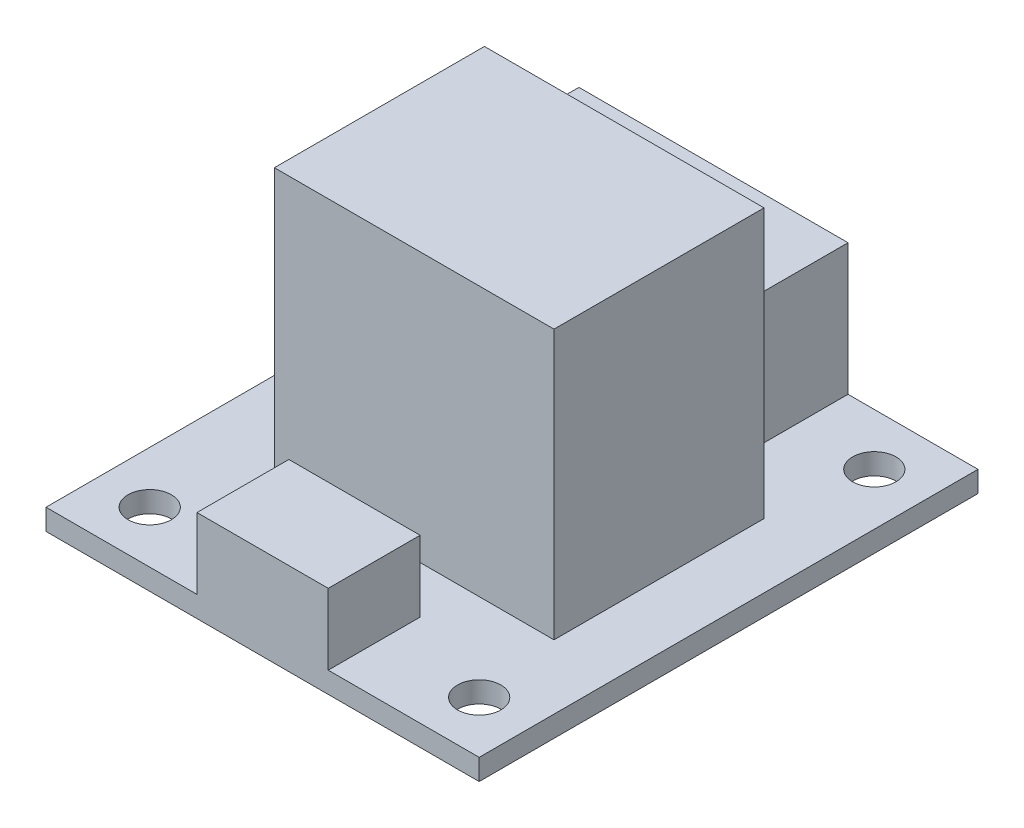
ISO-10303-21;
HEADER;
FILE_DESCRIPTION(('STEP AP214'),'2;1');
FILE_NAME('part.step','',(''),(''),'','','');
FILE_SCHEMA(('AUTOMOTIVE_DESIGN { 1 0 10303 214 1 1 1 1 }'));
ENDSEC;
DATA;
#1=APPLICATION_CONTEXT('core data for automotive mechanical design processes');
#2=APPLICATION_PROTOCOL_DEFINITION('international standard','automotive_design',2000,#1);
#3=PRODUCT_CONTEXT('',#1,'mechanical');
#4=PRODUCT('Part','Part','',(#3));
#5=PRODUCT_RELATED_PRODUCT_CATEGORY('part','',(#4));
#6=PRODUCT_DEFINITION_FORMATION('','',#4);
#7=PRODUCT_DEFINITION_CONTEXT('part definition',#1,'design');
#8=PRODUCT_DEFINITION('design','',#6,#7);
#9=PRODUCT_DEFINITION_SHAPE('','',#8);
#10=(LENGTH_UNIT() NAMED_UNIT(*) SI_UNIT(.MILLI.,.METRE.));
#11=(NAMED_UNIT(*) PLANE_ANGLE_UNIT() SI_UNIT($,.RADIAN.));
#12=(NAMED_UNIT(*) SI_UNIT($,.STERADIAN.) SOLID_ANGLE_UNIT());
#13=UNCERTAINTY_MEASURE_WITH_UNIT(LENGTH_MEASURE(1.E-05),#10,'distance_accuracy_value','');
#14=(GEOMETRIC_REPRESENTATION_CONTEXT(3) GLOBAL_UNCERTAINTY_ASSIGNED_CONTEXT((#13)) GLOBAL_UNIT_ASSIGNED_CONTEXT((#10,
#11,#12)) REPRESENTATION_CONTEXT('',''));
#15=CARTESIAN_POINT('',(0.,0.,0.));
#16=DIRECTION('',(0.,0.,1.));
#17=DIRECTION('',(1.,0.,0.));
#18=AXIS2_PLACEMENT_3D('',#15,#16,#17);
#19=CARTESIAN_POINT('',(0.,1.6,0.));
#20=DIRECTION('',(0.,-1.,0.));
#21=DIRECTION('',(0.,0.,-1.));
#22=AXIS2_PLACEMENT_3D('',#19,#20,#21);
#23=PLANE('',#22);
#24=DIRECTION('',(0.,0.,1.));
#25=VECTOR('',#24,1.);
#26=CARTESIAN_POINT('',(6.8,1.6,-26.6));
#27=LINE('',#26,#25);
#28=CARTESIAN_POINT('',(6.8,1.6,-26.6));
#29=VERTEX_POINT('',#28);
#30=CARTESIAN_POINT('',(6.8,1.6,-10.6));
#31=VERTEX_POINT('',#30);
#32=EDGE_CURVE('E168',#29,#31,#27,.T.);
#33=ORIENTED_EDGE('',*,*,#32,.F.);
#34=DIRECTION('',(-1.,0.,0.));
#35=VECTOR('',#34,1.);
#36=CARTESIAN_POINT('',(6.8,1.6,-26.6));
#37=LINE('',#36,#35);
#38=CARTESIAN_POINT('',(28.1,1.6,-26.6));
#39=VERTEX_POINT('',#38);
#40=EDGE_CURVE('E181',#39,#29,#37,.T.);
#41=ORIENTED_EDGE('',*,*,#40,.F.);
#42=DIRECTION('',(0.,0.,-1.));
#43=VECTOR('',#42,1.);
#44=CARTESIAN_POINT('',(28.1,1.6,-26.6));
#45=LINE('',#44,#43);
#46=CARTESIAN_POINT('',(28.1,1.6,-10.6));
#47=VERTEX_POINT('',#46);
#48=EDGE_CURVE('E190',#47,#39,#45,.T.);
#49=ORIENTED_EDGE('',*,*,#48,.F.);
#50=DIRECTION('',(1.,0.,0.));
#51=VECTOR('',#50,1.);
#52=CARTESIAN_POINT('',(6.8,1.6,-10.6));
#53=LINE('',#52,#51);
#54=EDGE_CURVE('E171',#31,#47,#53,.T.);
#55=ORIENTED_EDGE('',*,*,#54,.F.);
#56=EDGE_LOOP('',(#33,#41,#49,#55));
#57=FACE_BOUND('',#56,.T.);
#58=CARTESIAN_POINT('',(29.05,1.6,-3.95));
#59=DIRECTION('',(0.,1.,0.));
#60=DIRECTION('',(0.,0.,1.));
#61=AXIS2_PLACEMENT_3D('',#58,#59,#60);
#62=CIRCLE('',#61,1.65);
#63=CARTESIAN_POINT('',(29.05,1.6,-2.3));
#64=VERTEX_POINT('',#63);
#65=EDGE_CURVE('E240',#64,#64,#62,.T.);
#66=ORIENTED_EDGE('',*,*,#65,.F.);
#67=EDGE_LOOP('',(#66));
#68=FACE_BOUND('',#67,.T.);
#69=CARTESIAN_POINT('',(3.95,1.6,-3.95));
#70=DIRECTION('',(0.,1.,0.));
#71=DIRECTION('',(0.,0.,-1.));
#72=AXIS2_PLACEMENT_3D('',#69,#70,#71);
#73=CIRCLE('',#72,1.65);
#74=CARTESIAN_POINT('',(3.95,1.6,-5.6));
#75=VERTEX_POINT('',#74);
#76=EDGE_CURVE('E241',#75,#75,#73,.T.);
#77=ORIENTED_EDGE('',*,*,#76,.F.);
#78=EDGE_LOOP('',(#77));
#79=FACE_BOUND('',#78,.T.);
#80=CARTESIAN_POINT('',(29.05,1.6,-34.05));
#81=DIRECTION('',(0.,1.,0.));
#82=DIRECTION('',(0.,0.,-1.));
#83=AXIS2_PLACEMENT_3D('',#80,#81,#82);
#84=CIRCLE('',#83,1.65);
#85=CARTESIAN_POINT('',(29.05,1.6,-35.7));
#86=VERTEX_POINT('',#85);
#87=EDGE_CURVE('E236',#86,#86,#84,.T.);
#88=ORIENTED_EDGE('',*,*,#87,.F.);
#89=EDGE_LOOP('',(#88));
#90=FACE_BOUND('',#89,.T.);
#91=DIRECTION('',(0.,0.,1.));
#92=VECTOR('',#91,1.);
#93=CARTESIAN_POINT('',(2.6,1.6,-38.));
#94=LINE('',#93,#92);
#95=CARTESIAN_POINT('',(2.6,1.6,-38.));
#96=VERTEX_POINT('',#95);
#97=CARTESIAN_POINT('',(2.6,1.6,-29.7));
#98=VERTEX_POINT('',#97);
#99=EDGE_CURVE('E167',#96,#98,#94,.T.);
#100=ORIENTED_EDGE('',*,*,#99,.F.);
#101=DIRECTION('',(-1.,0.,0.));
#102=VECTOR('',#101,1.);
#103=CARTESIAN_POINT('',(0.,1.6,-38.));
#104=LINE('',#103,#102);
#105=CARTESIAN_POINT('',(0.,1.6,-38.));
#106=VERTEX_POINT('',#105);
#107=EDGE_CURVE('E264',#96,#106,#104,.T.);
#108=ORIENTED_EDGE('',*,*,#107,.T.);
#109=DIRECTION('',(0.,0.,1.));
#110=VECTOR('',#109,1.);
#111=CARTESIAN_POINT('',(0.,1.6,0.));
#112=LINE('',#111,#110);
#113=CARTESIAN_POINT('',(0.,1.6,0.));
#114=VERTEX_POINT('',#113);
#115=EDGE_CURVE('E255',#106,#114,#112,.T.);
#116=ORIENTED_EDGE('',*,*,#115,.T.);
#117=DIRECTION('',(1.,0.,0.));
#118=VECTOR('',#117,1.);
#119=CARTESIAN_POINT('',(0.,1.6,0.));
#120=LINE('',#119,#118);
#121=CARTESIAN_POINT('',(11.5,1.6,0.));
#122=VERTEX_POINT('',#121);
#123=EDGE_CURVE('E260',#114,#122,#120,.T.);
#124=ORIENTED_EDGE('',*,*,#123,.T.);
#125=DIRECTION('',(0.,0.,1.));
#126=VECTOR('',#125,1.);
#127=CARTESIAN_POINT('',(11.5,1.6,-7.));
#128=LINE('',#127,#126);
#129=CARTESIAN_POINT('',(11.5,1.6,-7.));
#130=VERTEX_POINT('',#129);
#131=EDGE_CURVE('E206',#130,#122,#128,.T.);
#132=ORIENTED_EDGE('',*,*,#131,.F.);
#133=DIRECTION('',(-1.,0.,0.));
#134=VECTOR('',#133,1.);
#135=CARTESIAN_POINT('',(21.5,1.6,-7.));
#136=LINE('',#135,#134);
#137=CARTESIAN_POINT('',(21.5,1.6,-7.));
#138=VERTEX_POINT('',#137);
#139=EDGE_CURVE('E211',#138,#130,#136,.T.);
#140=ORIENTED_EDGE('',*,*,#139,.F.);
#141=DIRECTION('',(0.,0.,-1.));
#142=VECTOR('',#141,1.);
#143=CARTESIAN_POINT('',(21.5,1.6,-7.));
#144=LINE('',#143,#142);
#145=CARTESIAN_POINT('',(21.5,1.6,0.));
#146=VERTEX_POINT('',#145);
#147=EDGE_CURVE('E220',#146,#138,#144,.T.);
#148=ORIENTED_EDGE('',*,*,#147,.F.);
#149=CARTESIAN_POINT('',(33.,1.6,0.));
#150=VERTEX_POINT('',#149);
#151=EDGE_CURVE('E258',#146,#150,#120,.T.);
#152=ORIENTED_EDGE('',*,*,#151,.T.);
#153=DIRECTION('',(0.,0.,-1.));
#154=VECTOR('',#153,1.);
#155=CARTESIAN_POINT('',(33.,1.6,0.));
#156=LINE('',#155,#154);
#157=CARTESIAN_POINT('',(33.,1.6,-38.));
#158=VERTEX_POINT('',#157);
#159=EDGE_CURVE('E262',#150,#158,#156,.T.);
#160=ORIENTED_EDGE('',*,*,#159,.T.);
#161=CARTESIAN_POINT('',(23.1,1.6,-38.));
#162=VERTEX_POINT('',#161);
#163=EDGE_CURVE('E265',#158,#162,#104,.T.);
#164=ORIENTED_EDGE('',*,*,#163,.T.);
#165=DIRECTION('',(0.,0.,-1.));
#166=VECTOR('',#165,1.);
#167=CARTESIAN_POINT('',(23.1,1.6,-38.));
#168=LINE('',#167,#166);
#169=CARTESIAN_POINT('',(23.1,1.6,-29.7));
#170=VERTEX_POINT('',#169);
#171=EDGE_CURVE('E54',#170,#162,#168,.T.);
#172=ORIENTED_EDGE('',*,*,#171,.F.);
#173=DIRECTION('',(1.,0.,0.));
#174=VECTOR('',#173,1.);
#175=CARTESIAN_POINT('',(2.6,1.6,-29.7));
#176=LINE('',#175,#174);
#177=EDGE_CURVE('E49',#98,#170,#176,.T.);
#178=ORIENTED_EDGE('',*,*,#177,.F.);
#179=EDGE_LOOP('',(#100,#108,#116,#124,#132,#140,#148,#152,#160,#164,#172,#178));
#180=FACE_BOUND('',#179,.T.);
#181=ADVANCED_FACE('F34',(#57,#68,#79,#90,#180),#23,.F.);
#182=CARTESIAN_POINT('',(0.,1.6,0.));
#183=DIRECTION('',(1.,0.,0.));
#184=DIRECTION('',(0.,0.,-1.));
#185=AXIS2_PLACEMENT_3D('',#182,#183,#184);
#186=PLANE('',#185);
#187=DIRECTION('',(0.,0.,1.));
#188=VECTOR('',#187,1.);
#189=CARTESIAN_POINT('',(0.,0.,0.));
#190=LINE('',#189,#188);
#191=CARTESIAN_POINT('',(0.,0.,-38.));
#192=VERTEX_POINT('',#191);
#193=CARTESIAN_POINT('',(0.,0.,0.));
#194=VERTEX_POINT('',#193);
#195=EDGE_CURVE('E252',#192,#194,#190,.T.);
#196=ORIENTED_EDGE('',*,*,#195,.T.);
#197=DIRECTION('',(0.,-1.,0.));
#198=VECTOR('',#197,1.);
#199=CARTESIAN_POINT('',(0.,1.6,0.));
#200=LINE('',#199,#198);
#201=EDGE_CURVE('E11',#114,#194,#200,.T.);
#202=ORIENTED_EDGE('',*,*,#201,.F.);
#203=ORIENTED_EDGE('',*,*,#115,.F.);
#204=DIRECTION('',(0.,-1.,0.));
#205=VECTOR('',#204,1.);
#206=CARTESIAN_POINT('',(0.,1.6,-38.));
#207=LINE('',#206,#205);
#208=EDGE_CURVE('E267',#106,#192,#207,.T.);
#209=ORIENTED_EDGE('',*,*,#208,.T.);
#210=EDGE_LOOP('',(#196,#202,#203,#209));
#211=FACE_BOUND('',#210,.T.);
#212=ADVANCED_FACE('F36',(#211),#186,.F.);
#213=CARTESIAN_POINT('',(0.,1.6,0.));
#214=DIRECTION('',(0.,0.,-1.));
#215=DIRECTION('',(-1.,0.,0.));
#216=AXIS2_PLACEMENT_3D('',#213,#214,#215);
#217=PLANE('',#216);
#218=DIRECTION('',(1.,0.,0.));
#219=VECTOR('',#218,1.);
#220=CARTESIAN_POINT('',(0.,0.,0.));
#221=LINE('',#220,#219);
#222=CARTESIAN_POINT('',(33.,0.,0.));
#223=VERTEX_POINT('',#222);
#224=EDGE_CURVE('E270',#194,#223,#221,.T.);
#225=ORIENTED_EDGE('',*,*,#224,.T.);
#226=DIRECTION('',(0.,-1.,0.));
#227=VECTOR('',#226,1.);
#228=CARTESIAN_POINT('',(33.,1.6,0.));
#229=LINE('',#228,#227);
#230=EDGE_CURVE('E42',#150,#223,#229,.T.);
#231=ORIENTED_EDGE('',*,*,#230,.F.);
#232=ORIENTED_EDGE('',*,*,#151,.F.);
#233=DIRECTION('',(0.,-1.,0.));
#234=VECTOR('',#233,1.);
#235=CARTESIAN_POINT('',(21.5,7.,0.));
#236=LINE('',#235,#234);
#237=CARTESIAN_POINT('',(21.5,7.,0.));
#238=VERTEX_POINT('',#237);
#239=EDGE_CURVE('E230',#238,#146,#236,.T.);
#240=ORIENTED_EDGE('',*,*,#239,.F.);
#241=DIRECTION('',(1.,0.,0.));
#242=VECTOR('',#241,1.);
#243=CARTESIAN_POINT('',(21.5,7.,0.));
#244=LINE('',#243,#242);
#245=CARTESIAN_POINT('',(11.5,7.,0.));
#246=VERTEX_POINT('',#245);
#247=EDGE_CURVE('E210',#246,#238,#244,.T.);
#248=ORIENTED_EDGE('',*,*,#247,.F.);
#249=DIRECTION('',(0.,-1.,0.));
#250=VECTOR('',#249,1.);
#251=CARTESIAN_POINT('',(11.5,7.,0.));
#252=LINE('',#251,#250);
#253=EDGE_CURVE('E233',#246,#122,#252,.T.);
#254=ORIENTED_EDGE('',*,*,#253,.T.);
#255=ORIENTED_EDGE('',*,*,#123,.F.);
#256=ORIENTED_EDGE('',*,*,#201,.T.);
#257=EDGE_LOOP('',(#225,#231,#232,#240,#248,#254,#255,#256));
#258=FACE_BOUND('',#257,.T.);
#259=ADVANCED_FACE('F311',(#258),#217,.F.);
#260=CARTESIAN_POINT('',(33.,1.6,0.));
#261=DIRECTION('',(-1.,0.,0.));
#262=DIRECTION('',(0.,0.,1.));
#263=AXIS2_PLACEMENT_3D('',#260,#261,#262);
#264=PLANE('',#263);
#265=DIRECTION('',(0.,0.,-1.));
#266=VECTOR('',#265,1.);
#267=CARTESIAN_POINT('',(33.,0.,0.));
#268=LINE('',#267,#266);
#269=CARTESIAN_POINT('',(33.,0.,-38.));
#270=VERTEX_POINT('',#269);
#271=EDGE_CURVE('E272',#223,#270,#268,.T.);
#272=ORIENTED_EDGE('',*,*,#271,.T.);
#273=DIRECTION('',(0.,-1.,0.));
#274=VECTOR('',#273,1.);
#275=CARTESIAN_POINT('',(33.,1.6,-38.));
#276=LINE('',#275,#274);
#277=EDGE_CURVE('E277',#158,#270,#276,.T.);
#278=ORIENTED_EDGE('',*,*,#277,.F.);
#279=ORIENTED_EDGE('',*,*,#159,.F.);
#280=ORIENTED_EDGE('',*,*,#230,.T.);
#281=EDGE_LOOP('',(#272,#278,#279,#280));
#282=FACE_BOUND('',#281,.T.);
#283=ADVANCED_FACE('F284',(#282),#264,.F.);
#284=CARTESIAN_POINT('',(0.,1.6,-38.));
#285=DIRECTION('',(0.,0.,1.));
#286=DIRECTION('',(1.,0.,0.));
#287=AXIS2_PLACEMENT_3D('',#284,#285,#286);
#288=PLANE('',#287);
#289=DIRECTION('',(-1.,0.,0.));
#290=VECTOR('',#289,1.);
#291=CARTESIAN_POINT('',(0.,0.,-38.));
#292=LINE('',#291,#290);
#293=EDGE_CURVE('E259',#270,#192,#292,.T.);
#294=ORIENTED_EDGE('',*,*,#293,.T.);
#295=ORIENTED_EDGE('',*,*,#208,.F.);
#296=ORIENTED_EDGE('',*,*,#107,.F.);
#297=DIRECTION('',(0.,-1.,0.));
#298=VECTOR('',#297,1.);
#299=CARTESIAN_POINT('',(2.6,11.6,-38.));
#300=LINE('',#299,#298);
#301=CARTESIAN_POINT('',(2.6,11.6,-38.));
#302=VERTEX_POINT('',#301);
#303=EDGE_CURVE('E299',#302,#96,#300,.T.);
#304=ORIENTED_EDGE('',*,*,#303,.F.);
#305=DIRECTION('',(-1.,0.,0.));
#306=VECTOR('',#305,1.);
#307=CARTESIAN_POINT('',(2.6,11.6,-38.));
#308=LINE('',#307,#306);
#309=CARTESIAN_POINT('',(23.1,11.6,-38.));
#310=VERTEX_POINT('',#309);
#311=EDGE_CURVE('E161',#310,#302,#308,.T.);
#312=ORIENTED_EDGE('',*,*,#311,.F.);
#313=DIRECTION('',(0.,-1.,0.));
#314=VECTOR('',#313,1.);
#315=CARTESIAN_POINT('',(23.1,11.6,-38.));
#316=LINE('',#315,#314);
#317=EDGE_CURVE('E173',#310,#162,#316,.T.);
#318=ORIENTED_EDGE('',*,*,#317,.T.);
#319=ORIENTED_EDGE('',*,*,#163,.F.);
#320=ORIENTED_EDGE('',*,*,#277,.T.);
#321=EDGE_LOOP('',(#294,#295,#296,#304,#312,#318,#319,#320));
#322=FACE_BOUND('',#321,.T.);
#323=ADVANCED_FACE('F294',(#322),#288,.F.);
#324=CARTESIAN_POINT('',(0.,0.,0.));
#325=DIRECTION('',(0.,-1.,0.));
#326=DIRECTION('',(0.,0.,-1.));
#327=AXIS2_PLACEMENT_3D('',#324,#325,#326);
#328=PLANE('',#327);
#329=CARTESIAN_POINT('',(29.05,0.,-34.05));
#330=DIRECTION('',(0.,1.,0.));
#331=DIRECTION('',(0.,0.,-1.));
#332=AXIS2_PLACEMENT_3D('',#329,#330,#331);
#333=CIRCLE('',#332,1.65);
#334=CARTESIAN_POINT('',(29.05,0.,-35.7));
#335=VERTEX_POINT('',#334);
#336=EDGE_CURVE('E244',#335,#335,#333,.T.);
#337=ORIENTED_EDGE('',*,*,#336,.T.);
#338=EDGE_LOOP('',(#337));
#339=FACE_BOUND('',#338,.T.);
#340=CARTESIAN_POINT('',(3.95,0.,-3.95));
#341=DIRECTION('',(0.,1.,0.));
#342=DIRECTION('',(0.,0.,-1.));
#343=AXIS2_PLACEMENT_3D('',#340,#341,#342);
#344=CIRCLE('',#343,1.65);
#345=CARTESIAN_POINT('',(3.95,0.,-5.6));
#346=VERTEX_POINT('',#345);
#347=EDGE_CURVE('E237',#346,#346,#344,.T.);
#348=ORIENTED_EDGE('',*,*,#347,.T.);
#349=EDGE_LOOP('',(#348));
#350=FACE_BOUND('',#349,.T.);
#351=CARTESIAN_POINT('',(29.05,0.,-3.95));
#352=DIRECTION('',(0.,1.,0.));
#353=DIRECTION('',(0.,0.,1.));
#354=AXIS2_PLACEMENT_3D('',#351,#352,#353);
#355=CIRCLE('',#354,1.65);
#356=CARTESIAN_POINT('',(29.05,0.,-2.3));
#357=VERTEX_POINT('',#356);
#358=EDGE_CURVE('E249',#357,#357,#355,.T.);
#359=ORIENTED_EDGE('',*,*,#358,.T.);
#360=EDGE_LOOP('',(#359));
#361=FACE_BOUND('',#360,.T.);
#362=ORIENTED_EDGE('',*,*,#195,.F.);
#363=ORIENTED_EDGE('',*,*,#293,.F.);
#364=ORIENTED_EDGE('',*,*,#271,.F.);
#365=ORIENTED_EDGE('',*,*,#224,.F.);
#366=EDGE_LOOP('',(#362,#363,#364,#365));
#367=FACE_BOUND('',#366,.T.);
#368=ADVANCED_FACE('F291',(#339,#350,#361,#367),#328,.T.);
#369=CARTESIAN_POINT('',(29.05,0.,-3.95));
#370=DIRECTION('',(0.,1.,0.));
#371=DIRECTION('',(0.,0.,1.));
#372=AXIS2_PLACEMENT_3D('',#369,#370,#371);
#373=CYLINDRICAL_SURFACE('',#372,1.65);
#374=ORIENTED_EDGE('',*,*,#358,.F.);
#375=EDGE_LOOP('',(#374));
#376=FACE_BOUND('',#375,.T.);
#377=ORIENTED_EDGE('',*,*,#65,.T.);
#378=EDGE_LOOP('',(#377));
#379=FACE_BOUND('',#378,.T.);
#380=ADVANCED_FACE('F344',(#376,#379),#373,.F.);
#381=CARTESIAN_POINT('',(3.95,0.,-3.95));
#382=DIRECTION('',(0.,1.,0.));
#383=DIRECTION('',(0.,0.,1.));
#384=AXIS2_PLACEMENT_3D('',#381,#382,#383);
#385=CYLINDRICAL_SURFACE('',#384,1.65);
#386=ORIENTED_EDGE('',*,*,#347,.F.);
#387=EDGE_LOOP('',(#386));
#388=FACE_BOUND('',#387,.T.);
#389=ORIENTED_EDGE('',*,*,#76,.T.);
#390=EDGE_LOOP('',(#389));
#391=FACE_BOUND('',#390,.T.);
#392=ADVANCED_FACE('F378',(#388,#391),#385,.F.);
#393=CARTESIAN_POINT('',(29.05,0.,-34.05));
#394=DIRECTION('',(0.,1.,0.));
#395=DIRECTION('',(0.,0.,1.));
#396=AXIS2_PLACEMENT_3D('',#393,#394,#395);
#397=CYLINDRICAL_SURFACE('',#396,1.65);
#398=ORIENTED_EDGE('',*,*,#336,.F.);
#399=EDGE_LOOP('',(#398));
#400=FACE_BOUND('',#399,.T.);
#401=ORIENTED_EDGE('',*,*,#87,.T.);
#402=EDGE_LOOP('',(#401));
#403=FACE_BOUND('',#402,.T.);
#404=ADVANCED_FACE('F385',(#400,#403),#397,.F.);
#405=CARTESIAN_POINT('',(11.5,7.,-7.));
#406=DIRECTION('',(1.,0.,0.));
#407=DIRECTION('',(0.,0.,-1.));
#408=AXIS2_PLACEMENT_3D('',#405,#406,#407);
#409=PLANE('',#408);
#410=ORIENTED_EDGE('',*,*,#131,.T.);
#411=ORIENTED_EDGE('',*,*,#253,.F.);
#412=DIRECTION('',(0.,0.,1.));
#413=VECTOR('',#412,1.);
#414=CARTESIAN_POINT('',(11.5,7.,-7.));
#415=LINE('',#414,#413);
#416=CARTESIAN_POINT('',(11.5,7.,-7.));
#417=VERTEX_POINT('',#416);
#418=EDGE_CURVE('E207',#417,#246,#415,.T.);
#419=ORIENTED_EDGE('',*,*,#418,.F.);
#420=DIRECTION('',(0.,-1.,0.));
#421=VECTOR('',#420,1.);
#422=CARTESIAN_POINT('',(11.5,7.,-7.));
#423=LINE('',#422,#421);
#424=EDGE_CURVE('E217',#417,#130,#423,.T.);
#425=ORIENTED_EDGE('',*,*,#424,.T.);
#426=EDGE_LOOP('',(#410,#411,#419,#425));
#427=FACE_BOUND('',#426,.T.);
#428=ADVANCED_FACE('F323',(#427),#409,.F.);
#429=CARTESIAN_POINT('',(21.5,7.,-7.));
#430=DIRECTION('',(-1.,0.,0.));
#431=DIRECTION('',(0.,0.,1.));
#432=AXIS2_PLACEMENT_3D('',#429,#430,#431);
#433=PLANE('',#432);
#434=ORIENTED_EDGE('',*,*,#147,.T.);
#435=DIRECTION('',(0.,-1.,0.));
#436=VECTOR('',#435,1.);
#437=CARTESIAN_POINT('',(21.5,7.,-7.));
#438=LINE('',#437,#436);
#439=CARTESIAN_POINT('',(21.5,7.,-7.));
#440=VERTEX_POINT('',#439);
#441=EDGE_CURVE('E227',#440,#138,#438,.T.);
#442=ORIENTED_EDGE('',*,*,#441,.F.);
#443=DIRECTION('',(0.,0.,-1.));
#444=VECTOR('',#443,1.);
#445=CARTESIAN_POINT('',(21.5,7.,-7.));
#446=LINE('',#445,#444);
#447=EDGE_CURVE('E213',#238,#440,#446,.T.);
#448=ORIENTED_EDGE('',*,*,#447,.F.);
#449=ORIENTED_EDGE('',*,*,#239,.T.);
#450=EDGE_LOOP('',(#434,#442,#448,#449));
#451=FACE_BOUND('',#450,.T.);
#452=ADVANCED_FACE('F314',(#451),#433,.F.);
#453=CARTESIAN_POINT('',(21.5,7.,-7.));
#454=DIRECTION('',(0.,0.,1.));
#455=DIRECTION('',(1.,0.,0.));
#456=AXIS2_PLACEMENT_3D('',#453,#454,#455);
#457=PLANE('',#456);
#458=ORIENTED_EDGE('',*,*,#139,.T.);
#459=ORIENTED_EDGE('',*,*,#424,.F.);
#460=DIRECTION('',(-1.,0.,0.));
#461=VECTOR('',#460,1.);
#462=CARTESIAN_POINT('',(21.5,7.,-7.));
#463=LINE('',#462,#461);
#464=EDGE_CURVE('E215',#440,#417,#463,.T.);
#465=ORIENTED_EDGE('',*,*,#464,.F.);
#466=ORIENTED_EDGE('',*,*,#441,.T.);
#467=EDGE_LOOP('',(#458,#459,#465,#466));
#468=FACE_BOUND('',#467,.T.);
#469=ADVANCED_FACE('F325',(#468),#457,.F.);
#470=CARTESIAN_POINT('',(0.,7.,0.));
#471=DIRECTION('',(0.,-1.,0.));
#472=DIRECTION('',(0.,0.,-1.));
#473=AXIS2_PLACEMENT_3D('',#470,#471,#472);
#474=PLANE('',#473);
#475=ORIENTED_EDGE('',*,*,#418,.T.);
#476=ORIENTED_EDGE('',*,*,#247,.T.);
#477=ORIENTED_EDGE('',*,*,#447,.T.);
#478=ORIENTED_EDGE('',*,*,#464,.T.);
#479=EDGE_LOOP('',(#475,#476,#477,#478));
#480=FACE_BOUND('',#479,.T.);
#481=ADVANCED_FACE('F318',(#480),#474,.F.);
#482=CARTESIAN_POINT('',(6.8,22.1,-26.6));
#483=DIRECTION('',(1.,0.,0.));
#484=DIRECTION('',(0.,0.,-1.));
#485=AXIS2_PLACEMENT_3D('',#482,#483,#484);
#486=PLANE('',#485);
#487=ORIENTED_EDGE('',*,*,#32,.T.);
#488=DIRECTION('',(0.,-1.,0.));
#489=VECTOR('',#488,1.);
#490=CARTESIAN_POINT('',(6.8,22.1,-10.6));
#491=LINE('',#490,#489);
#492=CARTESIAN_POINT('',(6.8,22.1,-10.6));
#493=VERTEX_POINT('',#492);
#494=EDGE_CURVE('E203',#493,#31,#491,.T.);
#495=ORIENTED_EDGE('',*,*,#494,.F.);
#496=DIRECTION('',(0.,0.,1.));
#497=VECTOR('',#496,1.);
#498=CARTESIAN_POINT('',(6.8,22.1,-26.6));
#499=LINE('',#498,#497);
#500=CARTESIAN_POINT('',(6.8,22.1,-26.6));
#501=VERTEX_POINT('',#500);
#502=EDGE_CURVE('E177',#501,#493,#499,.T.);
#503=ORIENTED_EDGE('',*,*,#502,.F.);
#504=DIRECTION('',(0.,-1.,0.));
#505=VECTOR('',#504,1.);
#506=CARTESIAN_POINT('',(6.8,22.1,-26.6));
#507=LINE('',#506,#505);
#508=EDGE_CURVE('E186',#501,#29,#507,.T.);
#509=ORIENTED_EDGE('',*,*,#508,.T.);
#510=EDGE_LOOP('',(#487,#495,#503,#509));
#511=FACE_BOUND('',#510,.T.);
#512=ADVANCED_FACE('F332',(#511),#486,.F.);
#513=CARTESIAN_POINT('',(6.8,22.1,-10.6));
#514=DIRECTION('',(0.,0.,-1.));
#515=DIRECTION('',(-1.,0.,0.));
#516=AXIS2_PLACEMENT_3D('',#513,#514,#515);
#517=PLANE('',#516);
#518=ORIENTED_EDGE('',*,*,#54,.T.);
#519=DIRECTION('',(0.,-1.,0.));
#520=VECTOR('',#519,1.);
#521=CARTESIAN_POINT('',(28.1,22.1,-10.6));
#522=LINE('',#521,#520);
#523=CARTESIAN_POINT('',(28.1,22.1,-10.6));
#524=VERTEX_POINT('',#523);
#525=EDGE_CURVE('E200',#524,#47,#522,.T.);
#526=ORIENTED_EDGE('',*,*,#525,.F.);
#527=DIRECTION('',(1.,0.,0.));
#528=VECTOR('',#527,1.);
#529=CARTESIAN_POINT('',(6.8,22.1,-10.6));
#530=LINE('',#529,#528);
#531=EDGE_CURVE('E180',#493,#524,#530,.T.);
#532=ORIENTED_EDGE('',*,*,#531,.F.);
#533=ORIENTED_EDGE('',*,*,#494,.T.);
#534=EDGE_LOOP('',(#518,#526,#532,#533));
#535=FACE_BOUND('',#534,.T.);
#536=ADVANCED_FACE('F420',(#535),#517,.F.);
#537=CARTESIAN_POINT('',(28.1,22.1,-26.6));
#538=DIRECTION('',(-1.,0.,0.));
#539=DIRECTION('',(0.,0.,1.));
#540=AXIS2_PLACEMENT_3D('',#537,#538,#539);
#541=PLANE('',#540);
#542=ORIENTED_EDGE('',*,*,#48,.T.);
#543=DIRECTION('',(0.,-1.,0.));
#544=VECTOR('',#543,1.);
#545=CARTESIAN_POINT('',(28.1,22.1,-26.6));
#546=LINE('',#545,#544);
#547=CARTESIAN_POINT('',(28.1,22.1,-26.6));
#548=VERTEX_POINT('',#547);
#549=EDGE_CURVE('E197',#548,#39,#546,.T.);
#550=ORIENTED_EDGE('',*,*,#549,.F.);
#551=DIRECTION('',(0.,0.,-1.));
#552=VECTOR('',#551,1.);
#553=CARTESIAN_POINT('',(28.1,22.1,-26.6));
#554=LINE('',#553,#552);
#555=EDGE_CURVE('E183',#524,#548,#554,.T.);
#556=ORIENTED_EDGE('',*,*,#555,.F.);
#557=ORIENTED_EDGE('',*,*,#525,.T.);
#558=EDGE_LOOP('',(#542,#550,#556,#557));
#559=FACE_BOUND('',#558,.T.);
#560=ADVANCED_FACE('F430',(#559),#541,.F.);
#561=CARTESIAN_POINT('',(6.8,22.1,-26.6));
#562=DIRECTION('',(0.,0.,1.));
#563=DIRECTION('',(1.,0.,0.));
#564=AXIS2_PLACEMENT_3D('',#561,#562,#563);
#565=PLANE('',#564);
#566=ORIENTED_EDGE('',*,*,#40,.T.);
#567=ORIENTED_EDGE('',*,*,#508,.F.);
#568=DIRECTION('',(-1.,0.,0.));
#569=VECTOR('',#568,1.);
#570=CARTESIAN_POINT('',(6.8,22.1,-26.6));
#571=LINE('',#570,#569);
#572=EDGE_CURVE('E185',#548,#501,#571,.T.);
#573=ORIENTED_EDGE('',*,*,#572,.F.);
#574=ORIENTED_EDGE('',*,*,#549,.T.);
#575=EDGE_LOOP('',(#566,#567,#573,#574));
#576=FACE_BOUND('',#575,.T.);
#577=ADVANCED_FACE('F440',(#576),#565,.F.);
#578=CARTESIAN_POINT('',(0.,22.1,0.));
#579=DIRECTION('',(0.,1.,0.));
#580=DIRECTION('',(0.,0.,1.));
#581=AXIS2_PLACEMENT_3D('',#578,#579,#580);
#582=PLANE('',#581);
#583=ORIENTED_EDGE('',*,*,#502,.T.);
#584=ORIENTED_EDGE('',*,*,#531,.T.);
#585=ORIENTED_EDGE('',*,*,#555,.T.);
#586=ORIENTED_EDGE('',*,*,#572,.T.);
#587=EDGE_LOOP('',(#583,#584,#585,#586));
#588=FACE_BOUND('',#587,.T.);
#589=ADVANCED_FACE('F450',(#588),#582,.T.);
#590=CARTESIAN_POINT('',(2.6,11.6,-38.));
#591=DIRECTION('',(1.,0.,0.));
#592=DIRECTION('',(0.,0.,-1.));
#593=AXIS2_PLACEMENT_3D('',#590,#591,#592);
#594=PLANE('',#593);
#595=ORIENTED_EDGE('',*,*,#99,.T.);
#596=DIRECTION('',(0.,-1.,0.));
#597=VECTOR('',#596,1.);
#598=CARTESIAN_POINT('',(2.6,11.6,-29.7));
#599=LINE('',#598,#597);
#600=CARTESIAN_POINT('',(2.6,11.6,-29.7));
#601=VERTEX_POINT('',#600);
#602=EDGE_CURVE('E149',#601,#98,#599,.T.);
#603=ORIENTED_EDGE('',*,*,#602,.F.);
#604=DIRECTION('',(0.,0.,1.));
#605=VECTOR('',#604,1.);
#606=CARTESIAN_POINT('',(2.6,11.6,-38.));
#607=LINE('',#606,#605);
#608=EDGE_CURVE('E156',#302,#601,#607,.T.);
#609=ORIENTED_EDGE('',*,*,#608,.F.);
#610=ORIENTED_EDGE('',*,*,#303,.T.);
#611=EDGE_LOOP('',(#595,#603,#609,#610));
#612=FACE_BOUND('',#611,.T.);
#613=ADVANCED_FACE('F166',(#612),#594,.F.);
#614=CARTESIAN_POINT('',(2.6,11.6,-29.7));
#615=DIRECTION('',(0.,0.,-1.));
#616=DIRECTION('',(-1.,0.,0.));
#617=AXIS2_PLACEMENT_3D('',#614,#615,#616);
#618=PLANE('',#617);
#619=ORIENTED_EDGE('',*,*,#177,.T.);
#620=DIRECTION('',(0.,-1.,0.));
#621=VECTOR('',#620,1.);
#622=CARTESIAN_POINT('',(23.1,11.6,-29.7));
#623=LINE('',#622,#621);
#624=CARTESIAN_POINT('',(23.1,11.6,-29.7));
#625=VERTEX_POINT('',#624);
#626=EDGE_CURVE('E152',#625,#170,#623,.T.);
#627=ORIENTED_EDGE('',*,*,#626,.F.);
#628=DIRECTION('',(1.,0.,0.));
#629=VECTOR('',#628,1.);
#630=CARTESIAN_POINT('',(2.6,11.6,-29.7));
#631=LINE('',#630,#629);
#632=EDGE_CURVE('E145',#601,#625,#631,.T.);
#633=ORIENTED_EDGE('',*,*,#632,.F.);
#634=ORIENTED_EDGE('',*,*,#602,.T.);
#635=EDGE_LOOP('',(#619,#627,#633,#634));
#636=FACE_BOUND('',#635,.T.);
#637=ADVANCED_FACE('F147',(#636),#618,.F.);
#638=CARTESIAN_POINT('',(23.1,11.6,-38.));
#639=DIRECTION('',(-1.,0.,0.));
#640=DIRECTION('',(0.,0.,1.));
#641=AXIS2_PLACEMENT_3D('',#638,#639,#640);
#642=PLANE('',#641);
#643=ORIENTED_EDGE('',*,*,#171,.T.);
#644=ORIENTED_EDGE('',*,*,#317,.F.);
#645=DIRECTION('',(0.,0.,-1.));
#646=VECTOR('',#645,1.);
#647=CARTESIAN_POINT('',(23.1,11.6,-38.));
#648=LINE('',#647,#646);
#649=EDGE_CURVE('E155',#625,#310,#648,.T.);
#650=ORIENTED_EDGE('',*,*,#649,.F.);
#651=ORIENTED_EDGE('',*,*,#626,.T.);
#652=EDGE_LOOP('',(#643,#644,#650,#651));
#653=FACE_BOUND('',#652,.T.);
#654=ADVANCED_FACE('F309',(#653),#642,.F.);
#655=CARTESIAN_POINT('',(0.,11.6,0.));
#656=DIRECTION('',(0.,1.,0.));
#657=DIRECTION('',(0.,0.,1.));
#658=AXIS2_PLACEMENT_3D('',#655,#656,#657);
#659=PLANE('',#658);
#660=ORIENTED_EDGE('',*,*,#608,.T.);
#661=ORIENTED_EDGE('',*,*,#632,.T.);
#662=ORIENTED_EDGE('',*,*,#649,.T.);
#663=ORIENTED_EDGE('',*,*,#311,.T.);
#664=EDGE_LOOP('',(#660,#661,#662,#663));
#665=FACE_BOUND('',#664,.T.);
#666=ADVANCED_FACE('F159',(#665),#659,.T.);
#667=CLOSED_SHELL('',(#181,#212,#259,#283,#323,#368,#380,#392,#404,#428,#452,#469,#481,#512,
#536,#560,#577,#589,#613,#637,#654,#666));
#668=MANIFOLD_SOLID_BREP('B2',#667);
#669=ADVANCED_BREP_SHAPE_REPRESENTATION('',(#18,#668),#14);
#670=SHAPE_DEFINITION_REPRESENTATION(#9,#669);
ENDSEC;
END-ISO-10303-21;
